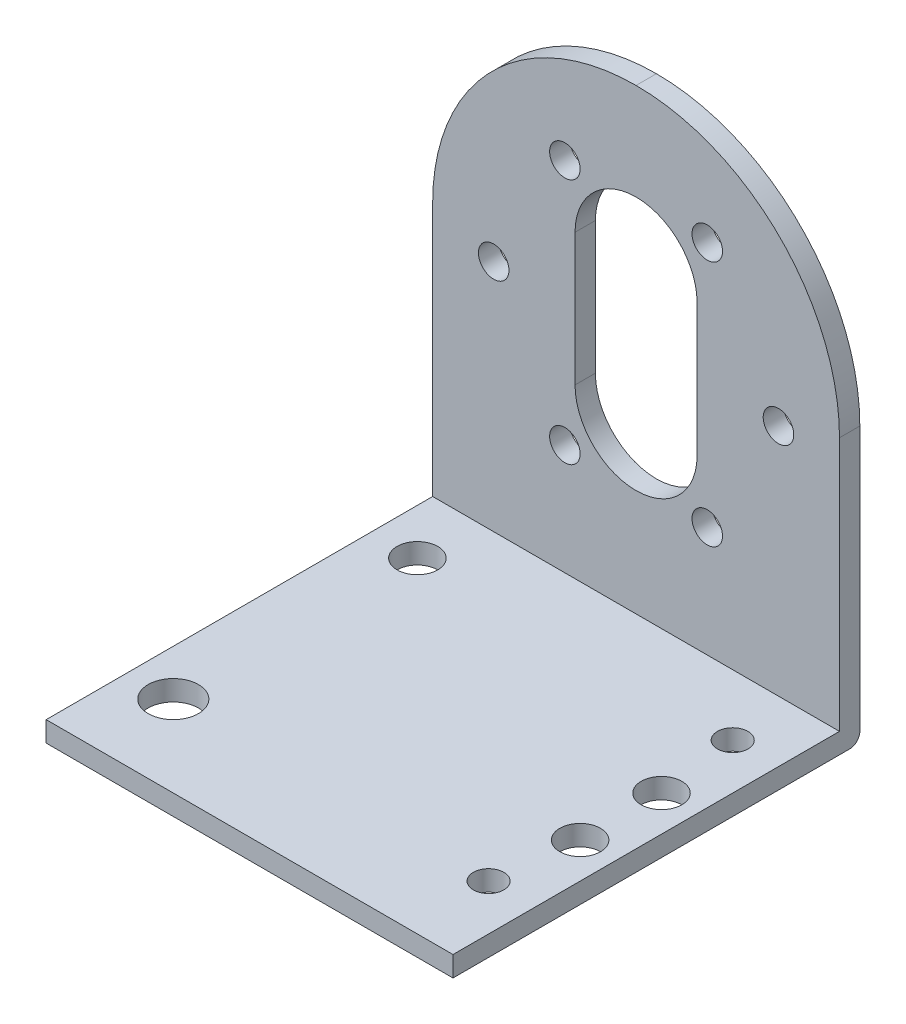
ISO-10303-21;
HEADER;
FILE_DESCRIPTION(('STEP AP214'),'2;1');
FILE_NAME('part.step','',(''),(''),'','','');
FILE_SCHEMA(('AUTOMOTIVE_DESIGN { 1 0 10303 214 1 1 1 1 }'));
ENDSEC;
DATA;
#1=APPLICATION_CONTEXT('core data for automotive mechanical design processes');
#2=APPLICATION_PROTOCOL_DEFINITION('international standard','automotive_design',2000,#1);
#3=PRODUCT_CONTEXT('',#1,'mechanical');
#4=PRODUCT('Part','Part','',(#3));
#5=PRODUCT_RELATED_PRODUCT_CATEGORY('part','',(#4));
#6=PRODUCT_DEFINITION_FORMATION('','',#4);
#7=PRODUCT_DEFINITION_CONTEXT('part definition',#1,'design');
#8=PRODUCT_DEFINITION('design','',#6,#7);
#9=PRODUCT_DEFINITION_SHAPE('','',#8);
#10=(LENGTH_UNIT() NAMED_UNIT(*) SI_UNIT(.MILLI.,.METRE.));
#11=(NAMED_UNIT(*) PLANE_ANGLE_UNIT() SI_UNIT($,.RADIAN.));
#12=(NAMED_UNIT(*) SI_UNIT($,.STERADIAN.) SOLID_ANGLE_UNIT());
#13=UNCERTAINTY_MEASURE_WITH_UNIT(LENGTH_MEASURE(1.E-05),#10,'distance_accuracy_value','');
#14=(GEOMETRIC_REPRESENTATION_CONTEXT(3) GLOBAL_UNCERTAINTY_ASSIGNED_CONTEXT((#13)) GLOBAL_UNIT_ASSIGNED_CONTEXT((#10,
#11,#12)) REPRESENTATION_CONTEXT('',''));
#15=CARTESIAN_POINT('',(0.,0.,0.));
#16=DIRECTION('',(0.,0.,1.));
#17=DIRECTION('',(1.,0.,0.));
#18=AXIS2_PLACEMENT_3D('',#15,#16,#17);
#19=CARTESIAN_POINT('',(-20.,2.,0.));
#20=DIRECTION('',(-1.,0.,0.));
#21=DIRECTION('',(0.,0.,1.));
#22=AXIS2_PLACEMENT_3D('',#19,#20,#21);
#23=PLANE('',#22);
#24=DIRECTION('',(0.,-1.,0.));
#25=VECTOR('',#24,1.);
#26=CARTESIAN_POINT('',(-20.,47.,-20.));
#27=LINE('',#26,#25);
#28=CARTESIAN_POINT('',(-20.,27.,-20.));
#29=VERTEX_POINT('',#28);
#30=CARTESIAN_POINT('',(-20.,1.,-20.));
#31=VERTEX_POINT('',#30);
#32=EDGE_CURVE('E364',#29,#31,#27,.T.);
#33=ORIENTED_EDGE('',*,*,#32,.T.);
#34=CARTESIAN_POINT('',(-20.,1.,-19.));
#35=DIRECTION('',(-1.,0.,0.));
#36=DIRECTION('',(0.,0.,1.));
#37=AXIS2_PLACEMENT_3D('',#34,#35,#36);
#38=CIRCLE('',#37,1.);
#39=CARTESIAN_POINT('',(-20.,0.,-19.));
#40=VERTEX_POINT('',#39);
#41=EDGE_CURVE('E487',#31,#40,#38,.T.);
#42=ORIENTED_EDGE('',*,*,#41,.T.);
#43=DIRECTION('',(0.,0.,-1.));
#44=VECTOR('',#43,1.);
#45=CARTESIAN_POINT('',(-20.,0.,0.));
#46=LINE('',#45,#44);
#47=CARTESIAN_POINT('',(-20.,0.,20.));
#48=VERTEX_POINT('',#47);
#49=EDGE_CURVE('E425',#48,#40,#46,.T.);
#50=ORIENTED_EDGE('',*,*,#49,.F.);
#51=DIRECTION('',(0.,-1.,0.));
#52=VECTOR('',#51,1.);
#53=CARTESIAN_POINT('',(-20.,2.,20.));
#54=LINE('',#53,#52);
#55=CARTESIAN_POINT('',(-20.,2.,20.));
#56=VERTEX_POINT('',#55);
#57=EDGE_CURVE('E458',#56,#48,#54,.T.);
#58=ORIENTED_EDGE('',*,*,#57,.F.);
#59=DIRECTION('',(0.,0.,-1.));
#60=VECTOR('',#59,1.);
#61=CARTESIAN_POINT('',(-20.,2.,0.));
#62=LINE('',#61,#60);
#63=CARTESIAN_POINT('',(-20.,2.,-18.));
#64=VERTEX_POINT('',#63);
#65=EDGE_CURVE('E384',#56,#64,#62,.T.);
#66=ORIENTED_EDGE('',*,*,#65,.T.);
#67=DIRECTION('',(0.,-1.,0.));
#68=VECTOR('',#67,1.);
#69=CARTESIAN_POINT('',(-20.,47.,-18.));
#70=LINE('',#69,#68);
#71=CARTESIAN_POINT('',(-20.,27.,-18.));
#72=VERTEX_POINT('',#71);
#73=EDGE_CURVE('E376',#72,#64,#70,.T.);
#74=ORIENTED_EDGE('',*,*,#73,.F.);
#75=DIRECTION('',(0.,0.,-1.));
#76=VECTOR('',#75,1.);
#77=CARTESIAN_POINT('',(-20.,27.,0.));
#78=LINE('',#77,#76);
#79=EDGE_CURVE('E477',#72,#29,#78,.T.);
#80=ORIENTED_EDGE('',*,*,#79,.T.);
#81=EDGE_LOOP('',(#33,#42,#50,#58,#66,#74,#80));
#82=FACE_BOUND('',#81,.T.);
#83=ADVANCED_FACE('F215',(#82),#23,.T.);
#84=CARTESIAN_POINT('',(0.,2.,20.));
#85=DIRECTION('',(0.,0.,1.));
#86=DIRECTION('',(1.,0.,0.));
#87=AXIS2_PLACEMENT_3D('',#84,#85,#86);
#88=PLANE('',#87);
#89=DIRECTION('',(-1.,0.,0.));
#90=VECTOR('',#89,1.);
#91=CARTESIAN_POINT('',(0.,0.,20.));
#92=LINE('',#91,#90);
#93=CARTESIAN_POINT('',(20.,0.,20.));
#94=VERTEX_POINT('',#93);
#95=EDGE_CURVE('E429',#94,#48,#92,.T.);
#96=ORIENTED_EDGE('',*,*,#95,.F.);
#97=DIRECTION('',(0.,-1.,0.));
#98=VECTOR('',#97,1.);
#99=CARTESIAN_POINT('',(20.,2.,20.));
#100=LINE('',#99,#98);
#101=CARTESIAN_POINT('',(20.,2.,20.));
#102=VERTEX_POINT('',#101);
#103=EDGE_CURVE('E421',#102,#94,#100,.T.);
#104=ORIENTED_EDGE('',*,*,#103,.F.);
#105=DIRECTION('',(-1.,0.,0.));
#106=VECTOR('',#105,1.);
#107=CARTESIAN_POINT('',(0.,2.,20.));
#108=LINE('',#107,#106);
#109=EDGE_CURVE('E389',#102,#56,#108,.T.);
#110=ORIENTED_EDGE('',*,*,#109,.T.);
#111=ORIENTED_EDGE('',*,*,#57,.T.);
#112=EDGE_LOOP('',(#96,#104,#110,#111));
#113=FACE_BOUND('',#112,.T.);
#114=ADVANCED_FACE('F546',(#113),#88,.T.);
#115=CARTESIAN_POINT('',(20.,2.,0.));
#116=DIRECTION('',(-1.,0.,0.));
#117=DIRECTION('',(0.,0.,1.));
#118=AXIS2_PLACEMENT_3D('',#115,#116,#117);
#119=PLANE('',#118);
#120=DIRECTION('',(0.,0.,-1.));
#121=VECTOR('',#120,1.);
#122=CARTESIAN_POINT('',(20.,0.,0.));
#123=LINE('',#122,#121);
#124=CARTESIAN_POINT('',(20.,0.,-19.));
#125=VERTEX_POINT('',#124);
#126=EDGE_CURVE('E433',#94,#125,#123,.T.);
#127=ORIENTED_EDGE('',*,*,#126,.T.);
#128=CARTESIAN_POINT('',(20.,1.,-19.));
#129=DIRECTION('',(-1.,0.,0.));
#130=DIRECTION('',(0.,0.,1.));
#131=AXIS2_PLACEMENT_3D('',#128,#129,#130);
#132=CIRCLE('',#131,1.);
#133=CARTESIAN_POINT('',(20.,1.,-20.));
#134=VERTEX_POINT('',#133);
#135=EDGE_CURVE('E493',#125,#134,#132,.F.);
#136=ORIENTED_EDGE('',*,*,#135,.T.);
#137=DIRECTION('',(0.,-1.,0.));
#138=VECTOR('',#137,1.);
#139=CARTESIAN_POINT('',(20.,47.,-20.));
#140=LINE('',#139,#138);
#141=CARTESIAN_POINT('',(20.,27.,-20.));
#142=VERTEX_POINT('',#141);
#143=EDGE_CURVE('E368',#142,#134,#140,.T.);
#144=ORIENTED_EDGE('',*,*,#143,.F.);
#145=DIRECTION('',(0.,0.,-1.));
#146=VECTOR('',#145,1.);
#147=CARTESIAN_POINT('',(20.,27.,-18.));
#148=LINE('',#147,#146);
#149=CARTESIAN_POINT('',(20.,27.,-18.));
#150=VERTEX_POINT('',#149);
#151=EDGE_CURVE('E467',#142,#150,#148,.F.);
#152=ORIENTED_EDGE('',*,*,#151,.T.);
#153=DIRECTION('',(0.,-1.,0.));
#154=VECTOR('',#153,1.);
#155=CARTESIAN_POINT('',(20.,47.,-18.));
#156=LINE('',#155,#154);
#157=CARTESIAN_POINT('',(20.,2.,-18.));
#158=VERTEX_POINT('',#157);
#159=EDGE_CURVE('E373',#150,#158,#156,.T.);
#160=ORIENTED_EDGE('',*,*,#159,.T.);
#161=DIRECTION('',(0.,0.,-1.));
#162=VECTOR('',#161,1.);
#163=CARTESIAN_POINT('',(20.,2.,0.));
#164=LINE('',#163,#162);
#165=EDGE_CURVE('E393',#102,#158,#164,.T.);
#166=ORIENTED_EDGE('',*,*,#165,.F.);
#167=ORIENTED_EDGE('',*,*,#103,.T.);
#168=EDGE_LOOP('',(#127,#136,#144,#152,#160,#166,#167));
#169=FACE_BOUND('',#168,.T.);
#170=ADVANCED_FACE('F552',(#169),#119,.F.);
#171=CARTESIAN_POINT('',(16.5,2.,-3.99999999999999));
#172=DIRECTION('',(0.,-1.,0.));
#173=DIRECTION('',(0.,0.,-1.));
#174=AXIS2_PLACEMENT_3D('',#171,#172,#173);
#175=CYLINDRICAL_SURFACE('',#174,2.);
#176=CARTESIAN_POINT('',(16.5,2.,-3.99999999999999));
#177=DIRECTION('',(0.,1.,0.));
#178=DIRECTION('',(0.,0.,1.));
#179=AXIS2_PLACEMENT_3D('',#176,#177,#178);
#180=CIRCLE('',#179,2.);
#181=CARTESIAN_POINT('',(16.5,2.,-1.99999999999999));
#182=VERTEX_POINT('',#181);
#183=EDGE_CURVE('E413',#182,#182,#180,.T.);
#184=ORIENTED_EDGE('',*,*,#183,.T.);
#185=EDGE_LOOP('',(#184));
#186=FACE_BOUND('',#185,.T.);
#187=CARTESIAN_POINT('',(16.5,0.,-3.99999999999999));
#188=DIRECTION('',(0.,1.,0.));
#189=DIRECTION('',(0.,0.,1.));
#190=AXIS2_PLACEMENT_3D('',#187,#188,#189);
#191=CIRCLE('',#190,2.);
#192=CARTESIAN_POINT('',(16.5,0.,-1.99999999999999));
#193=VERTEX_POINT('',#192);
#194=EDGE_CURVE('E449',#193,#193,#191,.T.);
#195=ORIENTED_EDGE('',*,*,#194,.F.);
#196=EDGE_LOOP('',(#195));
#197=FACE_BOUND('',#196,.T.);
#198=ADVANCED_FACE('F604',(#186,#197),#175,.F.);
#199=CARTESIAN_POINT('',(-15.5,2.,12.));
#200=DIRECTION('',(0.,-1.,0.));
#201=DIRECTION('',(0.,0.,-1.));
#202=AXIS2_PLACEMENT_3D('',#199,#200,#201);
#203=CYLINDRICAL_SURFACE('',#202,2.47487373415291);
#204=CARTESIAN_POINT('',(-15.5,2.,12.));
#205=DIRECTION('',(0.,1.,0.));
#206=DIRECTION('',(0.,0.,1.));
#207=AXIS2_PLACEMENT_3D('',#204,#205,#206);
#208=CIRCLE('',#207,2.47487373415291);
#209=CARTESIAN_POINT('',(-15.5,2.,14.4748737341529));
#210=VERTEX_POINT('',#209);
#211=EDGE_CURVE('E409',#210,#210,#208,.T.);
#212=ORIENTED_EDGE('',*,*,#211,.T.);
#213=EDGE_LOOP('',(#212));
#214=FACE_BOUND('',#213,.T.);
#215=CARTESIAN_POINT('',(-15.5,0.,12.));
#216=DIRECTION('',(0.,1.,0.));
#217=DIRECTION('',(0.,0.,1.));
#218=AXIS2_PLACEMENT_3D('',#215,#216,#217);
#219=CIRCLE('',#218,2.47487373415291);
#220=CARTESIAN_POINT('',(-15.5,0.,14.4748737341529));
#221=VERTEX_POINT('',#220);
#222=EDGE_CURVE('E445',#221,#221,#219,.T.);
#223=ORIENTED_EDGE('',*,*,#222,.F.);
#224=EDGE_LOOP('',(#223));
#225=FACE_BOUND('',#224,.T.);
#226=ADVANCED_FACE('F608',(#214,#225),#203,.F.);
#227=CARTESIAN_POINT('',(-15.5,2.,-12.));
#228=DIRECTION('',(0.,-1.,0.));
#229=DIRECTION('',(0.,0.,-1.));
#230=AXIS2_PLACEMENT_3D('',#227,#228,#229);
#231=CYLINDRICAL_SURFACE('',#230,2.);
#232=CARTESIAN_POINT('',(-15.5,2.,-12.));
#233=DIRECTION('',(0.,1.,0.));
#234=DIRECTION('',(0.,0.,1.));
#235=AXIS2_PLACEMENT_3D('',#232,#233,#234);
#236=CIRCLE('',#235,2.);
#237=CARTESIAN_POINT('',(-15.5,2.,-9.99999999999999));
#238=VERTEX_POINT('',#237);
#239=EDGE_CURVE('E405',#238,#238,#236,.T.);
#240=ORIENTED_EDGE('',*,*,#239,.T.);
#241=EDGE_LOOP('',(#240));
#242=FACE_BOUND('',#241,.T.);
#243=CARTESIAN_POINT('',(-15.5,0.,-12.));
#244=DIRECTION('',(0.,1.,0.));
#245=DIRECTION('',(0.,0.,1.));
#246=AXIS2_PLACEMENT_3D('',#243,#244,#245);
#247=CIRCLE('',#246,2.);
#248=CARTESIAN_POINT('',(-15.5,0.,-9.99999999999999));
#249=VERTEX_POINT('',#248);
#250=EDGE_CURVE('E441',#249,#249,#247,.T.);
#251=ORIENTED_EDGE('',*,*,#250,.F.);
#252=EDGE_LOOP('',(#251));
#253=FACE_BOUND('',#252,.T.);
#254=ADVANCED_FACE('F614',(#242,#253),#231,.F.);
#255=CARTESIAN_POINT('',(15.5,2.,12.));
#256=DIRECTION('',(0.,-1.,0.));
#257=DIRECTION('',(0.,0.,-1.));
#258=AXIS2_PLACEMENT_3D('',#255,#256,#257);
#259=CYLINDRICAL_SURFACE('',#258,1.5);
#260=CARTESIAN_POINT('',(15.5,2.,12.));
#261=DIRECTION('',(0.,1.,0.));
#262=DIRECTION('',(0.,0.,1.));
#263=AXIS2_PLACEMENT_3D('',#260,#261,#262);
#264=CIRCLE('',#263,1.5);
#265=CARTESIAN_POINT('',(15.5,2.,13.5));
#266=VERTEX_POINT('',#265);
#267=EDGE_CURVE('E401',#266,#266,#264,.T.);
#268=ORIENTED_EDGE('',*,*,#267,.T.);
#269=EDGE_LOOP('',(#268));
#270=FACE_BOUND('',#269,.T.);
#271=CARTESIAN_POINT('',(15.5,0.,12.));
#272=DIRECTION('',(0.,1.,0.));
#273=DIRECTION('',(0.,0.,1.));
#274=AXIS2_PLACEMENT_3D('',#271,#272,#273);
#275=CIRCLE('',#274,1.5);
#276=CARTESIAN_POINT('',(15.5,0.,13.5));
#277=VERTEX_POINT('',#276);
#278=EDGE_CURVE('E437',#277,#277,#275,.T.);
#279=ORIENTED_EDGE('',*,*,#278,.F.);
#280=EDGE_LOOP('',(#279));
#281=FACE_BOUND('',#280,.T.);
#282=ADVANCED_FACE('F561',(#270,#281),#259,.F.);
#283=CARTESIAN_POINT('',(15.5,2.,-12.));
#284=DIRECTION('',(0.,-1.,0.));
#285=DIRECTION('',(0.,0.,-1.));
#286=AXIS2_PLACEMENT_3D('',#283,#284,#285);
#287=CYLINDRICAL_SURFACE('',#286,1.5);
#288=CARTESIAN_POINT('',(15.5,2.,-12.));
#289=DIRECTION('',(0.,1.,0.));
#290=DIRECTION('',(0.,0.,1.));
#291=AXIS2_PLACEMENT_3D('',#288,#289,#290);
#292=CIRCLE('',#291,1.5);
#293=CARTESIAN_POINT('',(15.5,2.,-10.5));
#294=VERTEX_POINT('',#293);
#295=EDGE_CURVE('E380',#294,#294,#292,.F.);
#296=ORIENTED_EDGE('',*,*,#295,.F.);
#297=EDGE_LOOP('',(#296));
#298=FACE_BOUND('',#297,.T.);
#299=CARTESIAN_POINT('',(15.5,0.,-12.));
#300=DIRECTION('',(0.,1.,0.));
#301=DIRECTION('',(0.,0.,1.));
#302=AXIS2_PLACEMENT_3D('',#299,#300,#301);
#303=CIRCLE('',#302,1.5);
#304=CARTESIAN_POINT('',(15.5,0.,-10.5));
#305=VERTEX_POINT('',#304);
#306=EDGE_CURVE('E379',#305,#305,#303,.F.);
#307=ORIENTED_EDGE('',*,*,#306,.T.);
#308=EDGE_LOOP('',(#307));
#309=FACE_BOUND('',#308,.T.);
#310=ADVANCED_FACE('F557',(#298,#309),#287,.F.);
#311=CARTESIAN_POINT('',(16.5,2.,3.99999999999999));
#312=DIRECTION('',(0.,-1.,0.));
#313=DIRECTION('',(0.,0.,-1.));
#314=AXIS2_PLACEMENT_3D('',#311,#312,#313);
#315=CYLINDRICAL_SURFACE('',#314,2.);
#316=CARTESIAN_POINT('',(16.5,2.,3.99999999999999));
#317=DIRECTION('',(0.,1.,0.));
#318=DIRECTION('',(0.,0.,1.));
#319=AXIS2_PLACEMENT_3D('',#316,#317,#318);
#320=CIRCLE('',#319,2.);
#321=CARTESIAN_POINT('',(16.5,2.,6.));
#322=VERTEX_POINT('',#321);
#323=EDGE_CURVE('E417',#322,#322,#320,.F.);
#324=ORIENTED_EDGE('',*,*,#323,.F.);
#325=EDGE_LOOP('',(#324));
#326=FACE_BOUND('',#325,.T.);
#327=CARTESIAN_POINT('',(16.5,0.,3.99999999999999));
#328=DIRECTION('',(0.,1.,0.));
#329=DIRECTION('',(0.,0.,1.));
#330=AXIS2_PLACEMENT_3D('',#327,#328,#329);
#331=CIRCLE('',#330,2.);
#332=CARTESIAN_POINT('',(16.5,0.,6.));
#333=VERTEX_POINT('',#332);
#334=EDGE_CURVE('E385',#333,#333,#331,.F.);
#335=ORIENTED_EDGE('',*,*,#334,.T.);
#336=EDGE_LOOP('',(#335));
#337=FACE_BOUND('',#336,.T.);
#338=ADVANCED_FACE('F560',(#326,#337),#315,.F.);
#339=CARTESIAN_POINT('',(0.,2.,0.));
#340=DIRECTION('',(0.,1.,0.));
#341=DIRECTION('',(0.,0.,1.));
#342=AXIS2_PLACEMENT_3D('',#339,#340,#341);
#343=PLANE('',#342);
#344=ORIENTED_EDGE('',*,*,#295,.T.);
#345=EDGE_LOOP('',(#344));
#346=FACE_BOUND('',#345,.T.);
#347=ORIENTED_EDGE('',*,*,#65,.F.);
#348=ORIENTED_EDGE('',*,*,#109,.F.);
#349=ORIENTED_EDGE('',*,*,#165,.T.);
#350=DIRECTION('',(1.,0.,0.));
#351=VECTOR('',#350,1.);
#352=CARTESIAN_POINT('',(0.,2.,-18.));
#353=LINE('',#352,#351);
#354=EDGE_CURVE('E397',#64,#158,#353,.T.);
#355=ORIENTED_EDGE('',*,*,#354,.F.);
#356=EDGE_LOOP('',(#347,#348,#349,#355));
#357=FACE_BOUND('',#356,.T.);
#358=ORIENTED_EDGE('',*,*,#267,.F.);
#359=EDGE_LOOP('',(#358));
#360=FACE_BOUND('',#359,.T.);
#361=ORIENTED_EDGE('',*,*,#239,.F.);
#362=EDGE_LOOP('',(#361));
#363=FACE_BOUND('',#362,.T.);
#364=ORIENTED_EDGE('',*,*,#211,.F.);
#365=EDGE_LOOP('',(#364));
#366=FACE_BOUND('',#365,.T.);
#367=ORIENTED_EDGE('',*,*,#183,.F.);
#368=EDGE_LOOP('',(#367));
#369=FACE_BOUND('',#368,.T.);
#370=ORIENTED_EDGE('',*,*,#323,.T.);
#371=EDGE_LOOP('',(#370));
#372=FACE_BOUND('',#371,.T.);
#373=ADVANCED_FACE('F596',(#346,#357,#360,#363,#366,#369,#372),#343,.T.);
#374=CARTESIAN_POINT('',(0.,0.,0.));
#375=DIRECTION('',(0.,1.,0.));
#376=DIRECTION('',(0.,0.,1.));
#377=AXIS2_PLACEMENT_3D('',#374,#375,#376);
#378=PLANE('',#377);
#379=ORIENTED_EDGE('',*,*,#306,.F.);
#380=EDGE_LOOP('',(#379));
#381=FACE_BOUND('',#380,.T.);
#382=ORIENTED_EDGE('',*,*,#49,.T.);
#383=DIRECTION('',(-1.,0.,0.));
#384=VECTOR('',#383,1.);
#385=CARTESIAN_POINT('',(0.,0.,-19.));
#386=LINE('',#385,#384);
#387=EDGE_CURVE('E490',#40,#125,#386,.F.);
#388=ORIENTED_EDGE('',*,*,#387,.T.);
#389=ORIENTED_EDGE('',*,*,#126,.F.);
#390=ORIENTED_EDGE('',*,*,#95,.T.);
#391=EDGE_LOOP('',(#382,#388,#389,#390));
#392=FACE_BOUND('',#391,.T.);
#393=ORIENTED_EDGE('',*,*,#278,.T.);
#394=EDGE_LOOP('',(#393));
#395=FACE_BOUND('',#394,.T.);
#396=ORIENTED_EDGE('',*,*,#250,.T.);
#397=EDGE_LOOP('',(#396));
#398=FACE_BOUND('',#397,.T.);
#399=ORIENTED_EDGE('',*,*,#222,.T.);
#400=EDGE_LOOP('',(#399));
#401=FACE_BOUND('',#400,.T.);
#402=ORIENTED_EDGE('',*,*,#194,.T.);
#403=EDGE_LOOP('',(#402));
#404=FACE_BOUND('',#403,.T.);
#405=ORIENTED_EDGE('',*,*,#334,.F.);
#406=EDGE_LOOP('',(#405));
#407=FACE_BOUND('',#406,.T.);
#408=ADVANCED_FACE('F587',(#381,#392,#395,#398,#401,#404,#407),#378,.F.);
#409=CARTESIAN_POINT('',(0.,47.,-18.));
#410=DIRECTION('',(0.,0.,-1.));
#411=DIRECTION('',(-1.,0.,0.));
#412=AXIS2_PLACEMENT_3D('',#409,#410,#411);
#413=PLANE('',#412);
#414=CARTESIAN_POINT('',(-14.,25.,-18.));
#415=DIRECTION('',(0.,0.,1.));
#416=DIRECTION('',(1.,0.,0.));
#417=AXIS2_PLACEMENT_3D('',#414,#415,#416);
#418=CIRCLE('',#417,1.5);
#419=CARTESIAN_POINT('',(-12.5,25.,-18.));
#420=VERTEX_POINT('',#419);
#421=EDGE_CURVE('E340',#420,#420,#418,.T.);
#422=ORIENTED_EDGE('',*,*,#421,.F.);
#423=EDGE_LOOP('',(#422));
#424=FACE_BOUND('',#423,.T.);
#425=CARTESIAN_POINT('',(6.99999999999998,37.1243556529822,-18.));
#426=DIRECTION('',(0.,0.,1.));
#427=DIRECTION('',(1.,0.,0.));
#428=AXIS2_PLACEMENT_3D('',#425,#426,#427);
#429=CIRCLE('',#428,1.5);
#430=CARTESIAN_POINT('',(8.49999999999998,37.1243556529822,-18.));
#431=VERTEX_POINT('',#430);
#432=EDGE_CURVE('E330',#431,#431,#429,.T.);
#433=ORIENTED_EDGE('',*,*,#432,.F.);
#434=EDGE_LOOP('',(#433));
#435=FACE_BOUND('',#434,.T.);
#436=DIRECTION('',(0.,-1.,0.));
#437=VECTOR('',#436,1.);
#438=CARTESIAN_POINT('',(-5.99999999999999,0.,-18.));
#439=LINE('',#438,#437);
#440=CARTESIAN_POINT('',(-6.,31.5,-18.));
#441=VERTEX_POINT('',#440);
#442=CARTESIAN_POINT('',(-6.,18.5,-18.));
#443=VERTEX_POINT('',#442);
#444=EDGE_CURVE('E328',#441,#443,#439,.T.);
#445=ORIENTED_EDGE('',*,*,#444,.F.);
#446=CARTESIAN_POINT('',(0.,31.5,-18.));
#447=DIRECTION('',(0.,0.,1.));
#448=DIRECTION('',(1.,0.,0.));
#449=AXIS2_PLACEMENT_3D('',#446,#447,#448);
#450=CIRCLE('',#449,6.);
#451=CARTESIAN_POINT('',(6.,31.5,-18.));
#452=VERTEX_POINT('',#451);
#453=EDGE_CURVE('E233',#452,#441,#450,.T.);
#454=ORIENTED_EDGE('',*,*,#453,.F.);
#455=DIRECTION('',(0.,-1.,0.));
#456=VECTOR('',#455,1.);
#457=CARTESIAN_POINT('',(6.00000000000001,0.,-18.));
#458=LINE('',#457,#456);
#459=CARTESIAN_POINT('',(6.00000000000001,18.5,-18.));
#460=VERTEX_POINT('',#459);
#461=EDGE_CURVE('E316',#452,#460,#458,.T.);
#462=ORIENTED_EDGE('',*,*,#461,.T.);
#463=CARTESIAN_POINT('',(0.,18.5,-18.));
#464=DIRECTION('',(0.,0.,1.));
#465=DIRECTION('',(1.,0.,0.));
#466=AXIS2_PLACEMENT_3D('',#463,#464,#465);
#467=CIRCLE('',#466,6.);
#468=EDGE_CURVE('E323',#443,#460,#467,.T.);
#469=ORIENTED_EDGE('',*,*,#468,.F.);
#470=EDGE_LOOP('',(#445,#454,#462,#469));
#471=FACE_BOUND('',#470,.T.);
#472=CARTESIAN_POINT('',(-7.00000000000001,37.1243556529822,-18.));
#473=DIRECTION('',(0.,0.,1.));
#474=DIRECTION('',(1.,0.,0.));
#475=AXIS2_PLACEMENT_3D('',#472,#473,#474);
#476=CIRCLE('',#475,1.5);
#477=CARTESIAN_POINT('',(-5.50000000000001,37.1243556529822,-18.));
#478=VERTEX_POINT('',#477);
#479=EDGE_CURVE('E335',#478,#478,#476,.T.);
#480=ORIENTED_EDGE('',*,*,#479,.F.);
#481=EDGE_LOOP('',(#480));
#482=FACE_BOUND('',#481,.T.);
#483=CARTESIAN_POINT('',(14.,25.,-18.));
#484=DIRECTION('',(0.,0.,1.));
#485=DIRECTION('',(1.,0.,0.));
#486=AXIS2_PLACEMENT_3D('',#483,#484,#485);
#487=CIRCLE('',#486,1.5);
#488=CARTESIAN_POINT('',(15.5,25.,-18.));
#489=VERTEX_POINT('',#488);
#490=EDGE_CURVE('E357',#489,#489,#487,.T.);
#491=ORIENTED_EDGE('',*,*,#490,.F.);
#492=EDGE_LOOP('',(#491));
#493=FACE_BOUND('',#492,.T.);
#494=CARTESIAN_POINT('',(6.99999999999999,12.8756443470179,-18.));
#495=DIRECTION('',(0.,0.,1.));
#496=DIRECTION('',(1.,0.,0.));
#497=AXIS2_PLACEMENT_3D('',#494,#495,#496);
#498=CIRCLE('',#497,1.5);
#499=CARTESIAN_POINT('',(8.49999999999999,12.8756443470179,-18.));
#500=VERTEX_POINT('',#499);
#501=EDGE_CURVE('E353',#500,#500,#498,.T.);
#502=ORIENTED_EDGE('',*,*,#501,.F.);
#503=EDGE_LOOP('',(#502));
#504=FACE_BOUND('',#503,.T.);
#505=CARTESIAN_POINT('',(-7.00000000000002,12.8756443470179,-18.));
#506=DIRECTION('',(0.,0.,1.));
#507=DIRECTION('',(1.,0.,0.));
#508=AXIS2_PLACEMENT_3D('',#505,#506,#507);
#509=CIRCLE('',#508,1.5);
#510=CARTESIAN_POINT('',(-5.50000000000002,12.8756443470179,-18.));
#511=VERTEX_POINT('',#510);
#512=EDGE_CURVE('E349',#511,#511,#509,.T.);
#513=ORIENTED_EDGE('',*,*,#512,.F.);
#514=EDGE_LOOP('',(#513));
#515=FACE_BOUND('',#514,.T.);
#516=ORIENTED_EDGE('',*,*,#159,.F.);
#517=CARTESIAN_POINT('',(0.,27.,-18.));
#518=DIRECTION('',(0.,0.,-1.));
#519=DIRECTION('',(-1.,0.,0.));
#520=AXIS2_PLACEMENT_3D('',#517,#518,#519);
#521=CIRCLE('',#520,20.);
#522=CARTESIAN_POINT('',(0.,47.,-18.));
#523=VERTEX_POINT('',#522);
#524=EDGE_CURVE('E474',#150,#523,#521,.F.);
#525=ORIENTED_EDGE('',*,*,#524,.T.);
#526=CARTESIAN_POINT('',(0.,27.,-18.));
#527=DIRECTION('',(0.,0.,-1.));
#528=DIRECTION('',(-1.,0.,0.));
#529=AXIS2_PLACEMENT_3D('',#526,#527,#528);
#530=CIRCLE('',#529,20.);
#531=EDGE_CURVE('E471',#523,#72,#530,.F.);
#532=ORIENTED_EDGE('',*,*,#531,.T.);
#533=ORIENTED_EDGE('',*,*,#73,.T.);
#534=ORIENTED_EDGE('',*,*,#354,.T.);
#535=EDGE_LOOP('',(#516,#525,#532,#533,#534));
#536=FACE_BOUND('',#535,.T.);
#537=ADVANCED_FACE('F326',(#424,#435,#471,#482,#493,#504,#515,#536),#413,.F.);
#538=CARTESIAN_POINT('',(0.,47.,-20.));
#539=DIRECTION('',(0.,0.,1.));
#540=DIRECTION('',(1.,0.,0.));
#541=AXIS2_PLACEMENT_3D('',#538,#539,#540);
#542=PLANE('',#541);
#543=CARTESIAN_POINT('',(-14.,25.,-20.));
#544=DIRECTION('',(0.,0.,1.));
#545=DIRECTION('',(1.,0.,0.));
#546=AXIS2_PLACEMENT_3D('',#543,#544,#545);
#547=CIRCLE('',#546,1.5);
#548=CARTESIAN_POINT('',(-12.5,25.,-20.));
#549=VERTEX_POINT('',#548);
#550=EDGE_CURVE('E219',#549,#549,#547,.T.);
#551=ORIENTED_EDGE('',*,*,#550,.T.);
#552=EDGE_LOOP('',(#551));
#553=FACE_BOUND('',#552,.T.);
#554=CARTESIAN_POINT('',(6.99999999999998,37.1243556529822,-20.));
#555=DIRECTION('',(0.,0.,1.));
#556=DIRECTION('',(1.,0.,0.));
#557=AXIS2_PLACEMENT_3D('',#554,#555,#556);
#558=CIRCLE('',#557,1.5);
#559=CARTESIAN_POINT('',(8.49999999999998,37.1243556529822,-20.));
#560=VERTEX_POINT('',#559);
#561=EDGE_CURVE('E513',#560,#560,#558,.T.);
#562=ORIENTED_EDGE('',*,*,#561,.T.);
#563=EDGE_LOOP('',(#562));
#564=FACE_BOUND('',#563,.T.);
#565=DIRECTION('',(0.,-1.,0.));
#566=VECTOR('',#565,1.);
#567=CARTESIAN_POINT('',(6.,47.,-20.));
#568=LINE('',#567,#566);
#569=CARTESIAN_POINT('',(6.,31.5,-20.));
#570=VERTEX_POINT('',#569);
#571=CARTESIAN_POINT('',(6.00000000000001,18.5,-20.));
#572=VERTEX_POINT('',#571);
#573=EDGE_CURVE('E225',#570,#572,#568,.T.);
#574=ORIENTED_EDGE('',*,*,#573,.F.);
#575=CARTESIAN_POINT('',(0.,31.5,-20.));
#576=DIRECTION('',(0.,0.,1.));
#577=DIRECTION('',(1.,0.,0.));
#578=AXIS2_PLACEMENT_3D('',#575,#576,#577);
#579=CIRCLE('',#578,6.);
#580=CARTESIAN_POINT('',(-6.,31.5,-20.));
#581=VERTEX_POINT('',#580);
#582=EDGE_CURVE('E12',#570,#581,#579,.T.);
#583=ORIENTED_EDGE('',*,*,#582,.T.);
#584=DIRECTION('',(0.,-1.,0.));
#585=VECTOR('',#584,1.);
#586=CARTESIAN_POINT('',(-6.00000000000001,47.,-20.));
#587=LINE('',#586,#585);
#588=CARTESIAN_POINT('',(-6.,18.5,-20.));
#589=VERTEX_POINT('',#588);
#590=EDGE_CURVE('E496',#581,#589,#587,.T.);
#591=ORIENTED_EDGE('',*,*,#590,.T.);
#592=CARTESIAN_POINT('',(0.,18.5,-20.));
#593=DIRECTION('',(0.,0.,1.));
#594=DIRECTION('',(1.,0.,0.));
#595=AXIS2_PLACEMENT_3D('',#592,#593,#594);
#596=CIRCLE('',#595,6.);
#597=EDGE_CURVE('E517',#589,#572,#596,.T.);
#598=ORIENTED_EDGE('',*,*,#597,.T.);
#599=EDGE_LOOP('',(#574,#583,#591,#598));
#600=FACE_BOUND('',#599,.T.);
#601=CARTESIAN_POINT('',(-7.00000000000001,37.1243556529822,-20.));
#602=DIRECTION('',(0.,0.,1.));
#603=DIRECTION('',(1.,0.,0.));
#604=AXIS2_PLACEMENT_3D('',#601,#602,#603);
#605=CIRCLE('',#604,1.5);
#606=CARTESIAN_POINT('',(-5.50000000000001,37.1243556529822,-20.));
#607=VERTEX_POINT('',#606);
#608=EDGE_CURVE('E509',#607,#607,#605,.T.);
#609=ORIENTED_EDGE('',*,*,#608,.T.);
#610=EDGE_LOOP('',(#609));
#611=FACE_BOUND('',#610,.T.);
#612=CARTESIAN_POINT('',(14.,25.,-20.));
#613=DIRECTION('',(0.,0.,1.));
#614=DIRECTION('',(1.,0.,0.));
#615=AXIS2_PLACEMENT_3D('',#612,#613,#614);
#616=CIRCLE('',#615,1.5);
#617=CARTESIAN_POINT('',(15.5,25.,-20.));
#618=VERTEX_POINT('',#617);
#619=EDGE_CURVE('E505',#618,#618,#616,.T.);
#620=ORIENTED_EDGE('',*,*,#619,.T.);
#621=EDGE_LOOP('',(#620));
#622=FACE_BOUND('',#621,.T.);
#623=CARTESIAN_POINT('',(6.99999999999999,12.8756443470179,-20.));
#624=DIRECTION('',(0.,0.,1.));
#625=DIRECTION('',(1.,0.,0.));
#626=AXIS2_PLACEMENT_3D('',#623,#624,#625);
#627=CIRCLE('',#626,1.5);
#628=CARTESIAN_POINT('',(8.49999999999999,12.8756443470179,-20.));
#629=VERTEX_POINT('',#628);
#630=EDGE_CURVE('E501',#629,#629,#627,.T.);
#631=ORIENTED_EDGE('',*,*,#630,.T.);
#632=EDGE_LOOP('',(#631));
#633=FACE_BOUND('',#632,.T.);
#634=CARTESIAN_POINT('',(-7.00000000000002,12.8756443470179,-20.));
#635=DIRECTION('',(0.,0.,1.));
#636=DIRECTION('',(1.,0.,0.));
#637=AXIS2_PLACEMENT_3D('',#634,#635,#636);
#638=CIRCLE('',#637,1.5);
#639=CARTESIAN_POINT('',(-5.50000000000002,12.8756443470179,-20.));
#640=VERTEX_POINT('',#639);
#641=EDGE_CURVE('E497',#640,#640,#638,.T.);
#642=ORIENTED_EDGE('',*,*,#641,.T.);
#643=EDGE_LOOP('',(#642));
#644=FACE_BOUND('',#643,.T.);
#645=ORIENTED_EDGE('',*,*,#143,.T.);
#646=DIRECTION('',(-1.,0.,0.));
#647=VECTOR('',#646,1.);
#648=CARTESIAN_POINT('',(0.,1.,-20.));
#649=LINE('',#648,#647);
#650=EDGE_CURVE('E480',#134,#31,#649,.T.);
#651=ORIENTED_EDGE('',*,*,#650,.T.);
#652=ORIENTED_EDGE('',*,*,#32,.F.);
#653=CARTESIAN_POINT('',(0.,27.,-20.));
#654=DIRECTION('',(0.,0.,1.));
#655=DIRECTION('',(1.,0.,0.));
#656=AXIS2_PLACEMENT_3D('',#653,#654,#655);
#657=CIRCLE('',#656,20.);
#658=CARTESIAN_POINT('',(0.,47.,-20.));
#659=VERTEX_POINT('',#658);
#660=EDGE_CURVE('E461',#29,#659,#657,.F.);
#661=ORIENTED_EDGE('',*,*,#660,.T.);
#662=CARTESIAN_POINT('',(0.,27.,-20.));
#663=DIRECTION('',(0.,0.,1.));
#664=DIRECTION('',(1.,0.,0.));
#665=AXIS2_PLACEMENT_3D('',#662,#663,#664);
#666=CIRCLE('',#665,20.);
#667=EDGE_CURVE('E464',#659,#142,#666,.F.);
#668=ORIENTED_EDGE('',*,*,#667,.T.);
#669=EDGE_LOOP('',(#645,#651,#652,#661,#668));
#670=FACE_BOUND('',#669,.T.);
#671=ADVANCED_FACE('F530',(#553,#564,#600,#611,#622,#633,#644,#670),#542,.F.);
#672=CARTESIAN_POINT('',(0.,27.,0.));
#673=DIRECTION('',(0.,0.,-1.));
#674=DIRECTION('',(-1.,0.,0.));
#675=AXIS2_PLACEMENT_3D('',#672,#673,#674);
#676=CYLINDRICAL_SURFACE('',#675,20.);
#677=ORIENTED_EDGE('',*,*,#79,.F.);
#678=ORIENTED_EDGE('',*,*,#531,.F.);
#679=DIRECTION('',(0.,0.,-1.));
#680=VECTOR('',#679,1.);
#681=CARTESIAN_POINT('',(0.,47.,0.));
#682=LINE('',#681,#680);
#683=EDGE_CURVE('E369',#659,#523,#682,.F.);
#684=ORIENTED_EDGE('',*,*,#683,.F.);
#685=ORIENTED_EDGE('',*,*,#660,.F.);
#686=EDGE_LOOP('',(#677,#678,#684,#685));
#687=FACE_BOUND('',#686,.T.);
#688=ADVANCED_FACE('F565',(#687),#676,.T.);
#689=CARTESIAN_POINT('',(0.,27.,0.));
#690=DIRECTION('',(0.,0.,1.));
#691=DIRECTION('',(1.,0.,0.));
#692=AXIS2_PLACEMENT_3D('',#689,#690,#691);
#693=CYLINDRICAL_SURFACE('',#692,20.);
#694=ORIENTED_EDGE('',*,*,#524,.F.);
#695=ORIENTED_EDGE('',*,*,#151,.F.);
#696=ORIENTED_EDGE('',*,*,#667,.F.);
#697=ORIENTED_EDGE('',*,*,#683,.T.);
#698=EDGE_LOOP('',(#694,#695,#696,#697));
#699=FACE_BOUND('',#698,.T.);
#700=ADVANCED_FACE('F563',(#699),#693,.T.);
#701=CARTESIAN_POINT('',(0.,1.,-19.));
#702=DIRECTION('',(-1.,0.,0.));
#703=DIRECTION('',(0.,0.,1.));
#704=AXIS2_PLACEMENT_3D('',#701,#702,#703);
#705=CYLINDRICAL_SURFACE('',#704,1.);
#706=ORIENTED_EDGE('',*,*,#135,.F.);
#707=ORIENTED_EDGE('',*,*,#387,.F.);
#708=ORIENTED_EDGE('',*,*,#41,.F.);
#709=ORIENTED_EDGE('',*,*,#650,.F.);
#710=EDGE_LOOP('',(#706,#707,#708,#709));
#711=FACE_BOUND('',#710,.T.);
#712=ADVANCED_FACE('F217',(#711),#705,.T.);
#713=CARTESIAN_POINT('',(-7.00000000000002,12.8756443470179,-65.));
#714=DIRECTION('',(0.,0.,1.));
#715=DIRECTION('',(1.,0.,0.));
#716=AXIS2_PLACEMENT_3D('',#713,#714,#715);
#717=CYLINDRICAL_SURFACE('',#716,1.5);
#718=ORIENTED_EDGE('',*,*,#512,.T.);
#719=EDGE_LOOP('',(#718));
#720=FACE_BOUND('',#719,.T.);
#721=ORIENTED_EDGE('',*,*,#641,.F.);
#722=EDGE_LOOP('',(#721));
#723=FACE_BOUND('',#722,.T.);
#724=ADVANCED_FACE('F645',(#720,#723),#717,.F.);
#725=CARTESIAN_POINT('',(6.99999999999999,12.8756443470179,-65.));
#726=DIRECTION('',(0.,0.,1.));
#727=DIRECTION('',(1.,0.,0.));
#728=AXIS2_PLACEMENT_3D('',#725,#726,#727);
#729=CYLINDRICAL_SURFACE('',#728,1.5);
#730=ORIENTED_EDGE('',*,*,#501,.T.);
#731=EDGE_LOOP('',(#730));
#732=FACE_BOUND('',#731,.T.);
#733=ORIENTED_EDGE('',*,*,#630,.F.);
#734=EDGE_LOOP('',(#733));
#735=FACE_BOUND('',#734,.T.);
#736=ADVANCED_FACE('F641',(#732,#735),#729,.F.);
#737=CARTESIAN_POINT('',(14.,25.,-65.));
#738=DIRECTION('',(0.,0.,1.));
#739=DIRECTION('',(1.,0.,0.));
#740=AXIS2_PLACEMENT_3D('',#737,#738,#739);
#741=CYLINDRICAL_SURFACE('',#740,1.5);
#742=ORIENTED_EDGE('',*,*,#490,.T.);
#743=EDGE_LOOP('',(#742));
#744=FACE_BOUND('',#743,.T.);
#745=ORIENTED_EDGE('',*,*,#619,.F.);
#746=EDGE_LOOP('',(#745));
#747=FACE_BOUND('',#746,.T.);
#748=ADVANCED_FACE('F637',(#744,#747),#741,.F.);
#749=CARTESIAN_POINT('',(-7.00000000000001,37.1243556529822,-65.));
#750=DIRECTION('',(0.,0.,1.));
#751=DIRECTION('',(1.,0.,0.));
#752=AXIS2_PLACEMENT_3D('',#749,#750,#751);
#753=CYLINDRICAL_SURFACE('',#752,1.5);
#754=ORIENTED_EDGE('',*,*,#479,.T.);
#755=EDGE_LOOP('',(#754));
#756=FACE_BOUND('',#755,.T.);
#757=ORIENTED_EDGE('',*,*,#608,.F.);
#758=EDGE_LOOP('',(#757));
#759=FACE_BOUND('',#758,.T.);
#760=ADVANCED_FACE('F634',(#756,#759),#753,.F.);
#761=CARTESIAN_POINT('',(0.,31.5,-65.));
#762=DIRECTION('',(0.,0.,1.));
#763=DIRECTION('',(1.,0.,0.));
#764=AXIS2_PLACEMENT_3D('',#761,#762,#763);
#765=CYLINDRICAL_SURFACE('',#764,6.);
#766=DIRECTION('',(0.,0.,1.));
#767=VECTOR('',#766,1.);
#768=CARTESIAN_POINT('',(6.,31.5,-65.));
#769=LINE('',#768,#767);
#770=EDGE_CURVE('E306',#570,#452,#769,.T.);
#771=ORIENTED_EDGE('',*,*,#770,.T.);
#772=ORIENTED_EDGE('',*,*,#453,.T.);
#773=DIRECTION('',(0.,0.,1.));
#774=VECTOR('',#773,1.);
#775=CARTESIAN_POINT('',(-6.,31.5,-65.));
#776=LINE('',#775,#774);
#777=EDGE_CURVE('E313',#581,#441,#776,.T.);
#778=ORIENTED_EDGE('',*,*,#777,.F.);
#779=ORIENTED_EDGE('',*,*,#582,.F.);
#780=EDGE_LOOP('',(#771,#772,#778,#779));
#781=FACE_BOUND('',#780,.T.);
#782=ADVANCED_FACE('F308',(#781),#765,.F.);
#783=CARTESIAN_POINT('',(6.00000000000001,0.,-65.));
#784=DIRECTION('',(-1.,0.,0.));
#785=DIRECTION('',(0.,-1.,0.));
#786=AXIS2_PLACEMENT_3D('',#783,#784,#785);
#787=PLANE('',#786);
#788=ORIENTED_EDGE('',*,*,#573,.T.);
#789=DIRECTION('',(0.,0.,1.));
#790=VECTOR('',#789,1.);
#791=CARTESIAN_POINT('',(6.00000000000001,18.5,-65.));
#792=LINE('',#791,#790);
#793=EDGE_CURVE('E312',#572,#460,#792,.T.);
#794=ORIENTED_EDGE('',*,*,#793,.T.);
#795=ORIENTED_EDGE('',*,*,#461,.F.);
#796=ORIENTED_EDGE('',*,*,#770,.F.);
#797=EDGE_LOOP('',(#788,#794,#795,#796));
#798=FACE_BOUND('',#797,.T.);
#799=ADVANCED_FACE('F317',(#798),#787,.T.);
#800=CARTESIAN_POINT('',(0.,18.5,-65.));
#801=DIRECTION('',(0.,0.,1.));
#802=DIRECTION('',(1.,0.,0.));
#803=AXIS2_PLACEMENT_3D('',#800,#801,#802);
#804=CYLINDRICAL_SURFACE('',#803,6.);
#805=DIRECTION('',(0.,0.,1.));
#806=VECTOR('',#805,1.);
#807=CARTESIAN_POINT('',(-6.,18.5,-65.));
#808=LINE('',#807,#806);
#809=EDGE_CURVE('E241',#589,#443,#808,.T.);
#810=ORIENTED_EDGE('',*,*,#809,.T.);
#811=ORIENTED_EDGE('',*,*,#468,.T.);
#812=ORIENTED_EDGE('',*,*,#793,.F.);
#813=ORIENTED_EDGE('',*,*,#597,.F.);
#814=EDGE_LOOP('',(#810,#811,#812,#813));
#815=FACE_BOUND('',#814,.T.);
#816=ADVANCED_FACE('F654',(#815),#804,.F.);
#817=CARTESIAN_POINT('',(-5.99999999999999,0.,-65.));
#818=DIRECTION('',(-1.,0.,0.));
#819=DIRECTION('',(0.,-1.,0.));
#820=AXIS2_PLACEMENT_3D('',#817,#818,#819);
#821=PLANE('',#820);
#822=ORIENTED_EDGE('',*,*,#777,.T.);
#823=ORIENTED_EDGE('',*,*,#444,.T.);
#824=ORIENTED_EDGE('',*,*,#809,.F.);
#825=ORIENTED_EDGE('',*,*,#590,.F.);
#826=EDGE_LOOP('',(#822,#823,#824,#825));
#827=FACE_BOUND('',#826,.T.);
#828=ADVANCED_FACE('F540',(#827),#821,.F.);
#829=CARTESIAN_POINT('',(6.99999999999998,37.1243556529822,-65.));
#830=DIRECTION('',(0.,0.,1.));
#831=DIRECTION('',(1.,0.,0.));
#832=AXIS2_PLACEMENT_3D('',#829,#830,#831);
#833=CYLINDRICAL_SURFACE('',#832,1.5);
#834=ORIENTED_EDGE('',*,*,#432,.T.);
#835=EDGE_LOOP('',(#834));
#836=FACE_BOUND('',#835,.T.);
#837=ORIENTED_EDGE('',*,*,#561,.F.);
#838=EDGE_LOOP('',(#837));
#839=FACE_BOUND('',#838,.T.);
#840=ADVANCED_FACE('F534',(#836,#839),#833,.F.);
#841=CARTESIAN_POINT('',(-14.,25.,-65.));
#842=DIRECTION('',(0.,0.,1.));
#843=DIRECTION('',(1.,0.,0.));
#844=AXIS2_PLACEMENT_3D('',#841,#842,#843);
#845=CYLINDRICAL_SURFACE('',#844,1.5);
#846=ORIENTED_EDGE('',*,*,#421,.T.);
#847=EDGE_LOOP('',(#846));
#848=FACE_BOUND('',#847,.T.);
#849=ORIENTED_EDGE('',*,*,#550,.F.);
#850=EDGE_LOOP('',(#849));
#851=FACE_BOUND('',#850,.T.);
#852=ADVANCED_FACE('F532',(#848,#851),#845,.F.);
#853=CLOSED_SHELL('',(#83,#114,#170,#198,#226,#254,#282,#310,#338,#373,#408,#537,#671,#688,#700,
#712,#724,#736,#748,#760,#782,#799,#816,#828,#840,#852));
#854=MANIFOLD_SOLID_BREP('B2',#853);
#855=ADVANCED_BREP_SHAPE_REPRESENTATION('',(#18,#854),#14);
#856=SHAPE_DEFINITION_REPRESENTATION(#9,#855);
ENDSEC;
END-ISO-10303-21;
